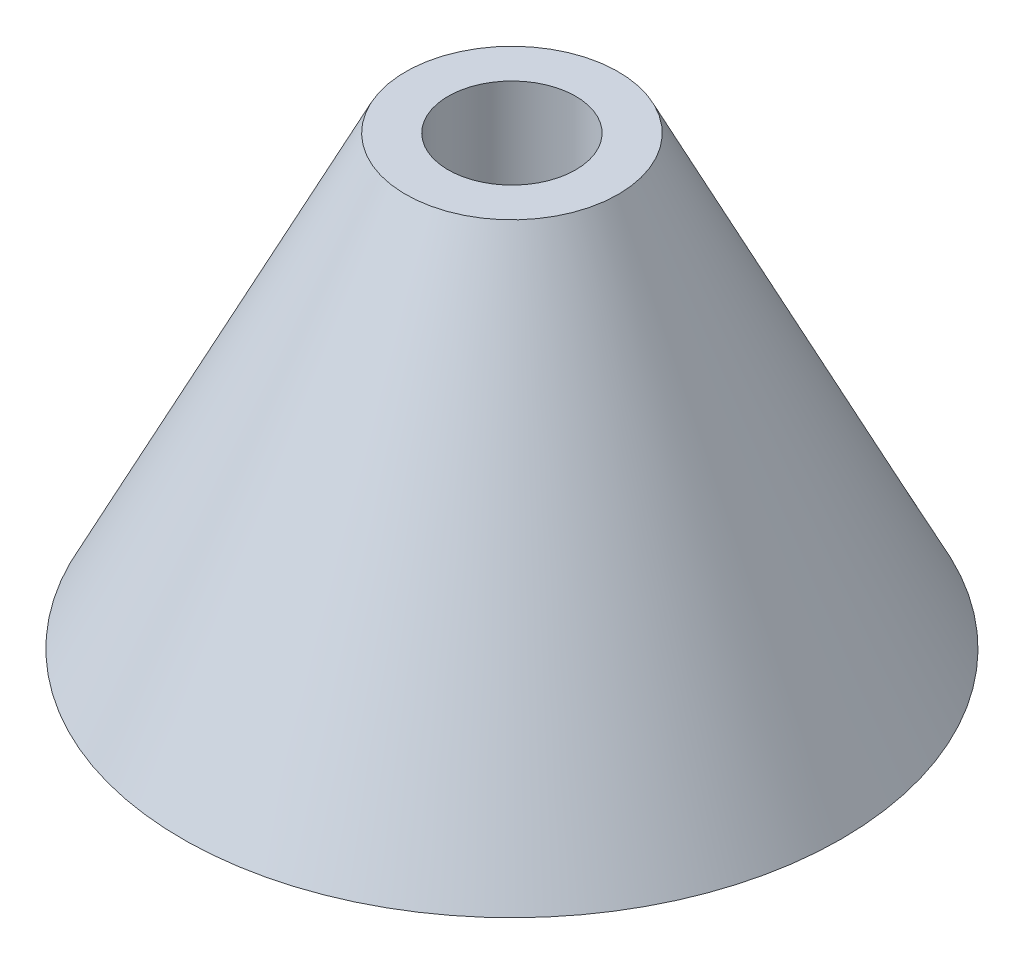
ISO-10303-21;
HEADER;
FILE_DESCRIPTION(('STEP AP214'),'2;1');
FILE_NAME('part.step','',(''),(''),'','','');
FILE_SCHEMA(('AUTOMOTIVE_DESIGN { 1 0 10303 214 1 1 1 1 }'));
ENDSEC;
DATA;
#1=APPLICATION_CONTEXT('core data for automotive mechanical design processes');
#2=APPLICATION_PROTOCOL_DEFINITION('international standard','automotive_design',2000,#1);
#3=PRODUCT_CONTEXT('',#1,'mechanical');
#4=PRODUCT('Part','Part','',(#3));
#5=PRODUCT_RELATED_PRODUCT_CATEGORY('part','',(#4));
#6=PRODUCT_DEFINITION_FORMATION('','',#4);
#7=PRODUCT_DEFINITION_CONTEXT('part definition',#1,'design');
#8=PRODUCT_DEFINITION('design','',#6,#7);
#9=PRODUCT_DEFINITION_SHAPE('','',#8);
#10=(LENGTH_UNIT() NAMED_UNIT(*) SI_UNIT(.MILLI.,.METRE.));
#11=(NAMED_UNIT(*) PLANE_ANGLE_UNIT() SI_UNIT($,.RADIAN.));
#12=(NAMED_UNIT(*) SI_UNIT($,.STERADIAN.) SOLID_ANGLE_UNIT());
#13=UNCERTAINTY_MEASURE_WITH_UNIT(LENGTH_MEASURE(1.E-05),#10,'distance_accuracy_value','');
#14=(GEOMETRIC_REPRESENTATION_CONTEXT(3) GLOBAL_UNCERTAINTY_ASSIGNED_CONTEXT((#13)) GLOBAL_UNIT_ASSIGNED_CONTEXT((#10,
#11,#12)) REPRESENTATION_CONTEXT('',''));
#15=CARTESIAN_POINT('',(0.,0.,0.));
#16=DIRECTION('',(0.,0.,1.));
#17=DIRECTION('',(1.,0.,0.));
#18=AXIS2_PLACEMENT_3D('',#15,#16,#17);
#19=CARTESIAN_POINT('',(31.,-5.22222222222258,0.));
#20=DIRECTION('',(0.,-1.,0.));
#21=DIRECTION('',(1.,0.,0.));
#22=AXIS2_PLACEMENT_3D('',#19,#20,#21);
#23=PLANE('',#22);
#24=CARTESIAN_POINT('',(0.,-5.22222222222273,0.));
#25=DIRECTION('',(0.,-1.,0.));
#26=DIRECTION('',(1.,0.,0.));
#27=AXIS2_PLACEMENT_3D('',#24,#25,#26);
#28=CIRCLE('',#27,31.);
#29=CARTESIAN_POINT('',(31.,-5.22222222222263,0.));
#30=VERTEX_POINT('',#29);
#31=EDGE_CURVE('E49',#30,#30,#28,.T.);
#32=ORIENTED_EDGE('',*,*,#31,.T.);
#33=EDGE_LOOP('',(#32));
#34=FACE_BOUND('',#33,.T.);
#35=CARTESIAN_POINT('',(0.,-5.22222222222265,0.));
#36=DIRECTION('',(0.,-1.,0.));
#37=DIRECTION('',(1.,0.,0.));
#38=AXIS2_PLACEMENT_3D('',#35,#36,#37);
#39=CIRCLE('',#38,5.99999999999998);
#40=CARTESIAN_POINT('',(6.,-5.22222222222263,0.));
#41=VERTEX_POINT('',#40);
#42=EDGE_CURVE('E10',#41,#41,#39,.T.);
#43=ORIENTED_EDGE('',*,*,#42,.F.);
#44=EDGE_LOOP('',(#43));
#45=FACE_BOUND('',#44,.T.);
#46=ADVANCED_FACE('F35',(#34,#45),#23,.T.);
#47=CARTESIAN_POINT('',(0.,0.,0.));
#48=DIRECTION('',(0.,-1.,0.));
#49=DIRECTION('',(1.,0.,0.));
#50=AXIS2_PLACEMENT_3D('',#47,#48,#49);
#51=CYLINDRICAL_SURFACE('',#50,6.00000000000002);
#52=ORIENTED_EDGE('',*,*,#42,.T.);
#53=EDGE_LOOP('',(#52));
#54=FACE_BOUND('',#53,.T.);
#55=CARTESIAN_POINT('',(-1.26173597950183E-13,36.7777777777774,0.));
#56=DIRECTION('',(0.,-1.,0.));
#57=DIRECTION('',(1.,0.,0.));
#58=AXIS2_PLACEMENT_3D('',#55,#56,#57);
#59=CIRCLE('',#58,6.00000000000006);
#60=CARTESIAN_POINT('',(5.99999999999994,36.7777777777774,0.));
#61=VERTEX_POINT('',#60);
#62=EDGE_CURVE('E41',#61,#61,#59,.T.);
#63=ORIENTED_EDGE('',*,*,#62,.F.);
#64=EDGE_LOOP('',(#63));
#65=FACE_BOUND('',#64,.T.);
#66=ADVANCED_FACE('F65',(#54,#65),#51,.F.);
#67=CARTESIAN_POINT('',(5.99999999999994,36.7777777777774,0.));
#68=DIRECTION('',(0.,1.,0.));
#69=DIRECTION('',(-1.,0.,0.));
#70=AXIS2_PLACEMENT_3D('',#67,#68,#69);
#71=PLANE('',#70);
#72=ORIENTED_EDGE('',*,*,#62,.T.);
#73=EDGE_LOOP('',(#72));
#74=FACE_BOUND('',#73,.T.);
#75=CARTESIAN_POINT('',(-1.26173597950183E-13,36.7777777777773,0.));
#76=DIRECTION('',(0.,-1.,0.));
#77=DIRECTION('',(1.,0.,0.));
#78=AXIS2_PLACEMENT_3D('',#75,#76,#77);
#79=CIRCLE('',#78,10.0000000000001);
#80=CARTESIAN_POINT('',(10.,36.7777777777774,0.));
#81=VERTEX_POINT('',#80);
#82=EDGE_CURVE('E45',#81,#81,#79,.T.);
#83=ORIENTED_EDGE('',*,*,#82,.F.);
#84=EDGE_LOOP('',(#83));
#85=FACE_BOUND('',#84,.T.);
#86=ADVANCED_FACE('F59',(#74,#85),#71,.T.);
#87=CARTESIAN_POINT('',(0.,-5.22222222222273,0.));
#88=DIRECTION('',(0.,-1.,0.));
#89=DIRECTION('',(1.,0.,0.));
#90=AXIS2_PLACEMENT_3D('',#87,#88,#89);
#91=CONICAL_SURFACE('',#90,31.,0.463647609000803);
#92=CARTESIAN_POINT('',(10.,36.7777777777774,0.));
#93=CARTESIAN_POINT('',(10.21875,36.3402777777774,0.));
#94=CARTESIAN_POINT('',(10.4375,35.9027777777774,0.));
#95=CARTESIAN_POINT('',(10.875,35.0277777777774,0.));
#96=CARTESIAN_POINT('',(11.09375,34.5902777777774,0.));
#97=CARTESIAN_POINT('',(11.53125,33.7152777777774,0.));
#98=CARTESIAN_POINT('',(11.75,33.2777777777774,0.));
#99=CARTESIAN_POINT('',(12.1875,32.4027777777774,0.));
#100=CARTESIAN_POINT('',(12.40625,31.9652777777774,0.));
#101=CARTESIAN_POINT('',(12.84375,31.0902777777774,0.));
#102=CARTESIAN_POINT('',(13.0625,30.6527777777774,0.));
#103=CARTESIAN_POINT('',(13.5,29.7777777777774,0.));
#104=CARTESIAN_POINT('',(13.71875,29.3402777777774,0.));
#105=CARTESIAN_POINT('',(14.15625,28.4652777777774,0.));
#106=CARTESIAN_POINT('',(14.375,28.0277777777774,0.));
#107=CARTESIAN_POINT('',(14.8125,27.1527777777774,0.));
#108=CARTESIAN_POINT('',(15.03125,26.7152777777774,0.));
#109=CARTESIAN_POINT('',(15.46875,25.8402777777774,0.));
#110=CARTESIAN_POINT('',(15.6875,25.4027777777774,0.));
#111=CARTESIAN_POINT('',(16.125,24.5277777777774,0.));
#112=CARTESIAN_POINT('',(16.34375,24.0902777777774,0.));
#113=CARTESIAN_POINT('',(16.78125,23.2152777777774,0.));
#114=CARTESIAN_POINT('',(17.,22.7777777777774,0.));
#115=CARTESIAN_POINT('',(17.4375,21.9027777777774,0.));
#116=CARTESIAN_POINT('',(17.65625,21.4652777777774,0.));
#117=CARTESIAN_POINT('',(18.09375,20.5902777777774,0.));
#118=CARTESIAN_POINT('',(18.3125,20.1527777777774,0.));
#119=CARTESIAN_POINT('',(18.75,19.2777777777774,0.));
#120=CARTESIAN_POINT('',(18.96875,18.8402777777774,0.));
#121=CARTESIAN_POINT('',(19.40625,17.9652777777774,0.));
#122=CARTESIAN_POINT('',(19.625,17.5277777777774,0.));
#123=CARTESIAN_POINT('',(20.0625,16.6527777777774,0.));
#124=CARTESIAN_POINT('',(20.28125,16.2152777777774,0.));
#125=CARTESIAN_POINT('',(20.71875,15.3402777777774,0.));
#126=CARTESIAN_POINT('',(20.9375,14.9027777777774,0.));
#127=CARTESIAN_POINT('',(21.375,14.0277777777774,0.));
#128=CARTESIAN_POINT('',(21.59375,13.5902777777774,0.));
#129=CARTESIAN_POINT('',(22.03125,12.7152777777774,0.));
#130=CARTESIAN_POINT('',(22.25,12.2777777777774,0.));
#131=CARTESIAN_POINT('',(22.6875,11.4027777777774,0.));
#132=CARTESIAN_POINT('',(22.90625,10.9652777777774,0.));
#133=CARTESIAN_POINT('',(23.34375,10.0902777777774,0.));
#134=CARTESIAN_POINT('',(23.5625,9.65277777777737,0.));
#135=CARTESIAN_POINT('',(24.,8.77777777777737,0.));
#136=CARTESIAN_POINT('',(24.21875,8.34027777777737,0.));
#137=CARTESIAN_POINT('',(24.65625,7.46527777777737,0.));
#138=CARTESIAN_POINT('',(24.875,7.02777777777737,0.));
#139=CARTESIAN_POINT('',(25.3125,6.15277777777737,0.));
#140=CARTESIAN_POINT('',(25.53125,5.71527777777737,0.));
#141=CARTESIAN_POINT('',(25.96875,4.84027777777737,0.));
#142=CARTESIAN_POINT('',(26.1875,4.40277777777737,0.));
#143=CARTESIAN_POINT('',(26.625,3.52777777777737,0.));
#144=CARTESIAN_POINT('',(26.84375,3.09027777777738,0.));
#145=CARTESIAN_POINT('',(27.28125,2.21527777777738,0.));
#146=CARTESIAN_POINT('',(27.5,1.77777777777738,0.));
#147=CARTESIAN_POINT('',(27.9375,0.902777777777375,0.));
#148=CARTESIAN_POINT('',(28.15625,0.465277777777373,0.));
#149=CARTESIAN_POINT('',(28.59375,-0.409722222222629,0.));
#150=CARTESIAN_POINT('',(28.8125,-0.847222222222628,0.));
#151=CARTESIAN_POINT('',(29.25,-1.72222222222263,0.));
#152=CARTESIAN_POINT('',(29.46875,-2.15972222222263,0.));
#153=CARTESIAN_POINT('',(29.90625,-3.03472222222263,0.));
#154=CARTESIAN_POINT('',(30.125,-3.47222222222263,0.));
#155=CARTESIAN_POINT('',(30.5625,-4.34722222222262,0.));
#156=CARTESIAN_POINT('',(30.78125,-4.78472222222262,0.));
#157=CARTESIAN_POINT('',(31.,-5.22222222222262,0.));
#158=B_SPLINE_CURVE_WITH_KNOTS('',3,(#92,#93,#94,#95,#96,#97,#98,#99,#100,#101,#102,#103,#104,
#105,#106,#107,#108,#109,#110,#111,#112,#113,#114,#115,#116,#117,#118,#119,#120,#121,#122,#123,
#124,#125,#126,#127,#128,#129,#130,#131,#132,#133,#134,#135,#136,#137,#138,#139,#140,#141,#142,
#143,#144,#145,#146,#147,#148,#149,#150,#151,#152,#153,#154,#155,#156,#157),.UNSPECIFIED.,.F.,
.F.,(4,2,2,2,2,2,2,2,2,2,2,2,2,2,2,2,2,2,2,2,2,2,2,2,2,2,2,2,2,2,2,2,4),(0.,1.46741961023424,
2.93483922046847,4.40225883070271,5.86967844093694,7.33709805117118,8.80451766140542,
10.2719372716397,11.7393568818739,13.2067764921081,14.6741961023424,16.1416157125766,
17.6090353228108,19.0764549330451,20.5438745432793,22.0112941535135,23.4787137637478,
24.946133373982,26.4135529842163,27.8809725944505,29.3483922046847,30.815811814919,
32.2832314251532,33.7506510353874,35.2180706456217,36.6854902558559,38.1529098660901,
39.6203294763244,41.0877490865586,42.5551686967929,44.0225883070271,45.4900079172613,
46.9574275274956),.UNSPECIFIED.);
#159=EDGE_CURVE('BSEAM57',#81,#30,#158,.T.);
#160=ORIENTED_EDGE('',*,*,#82,.T.);
#161=ORIENTED_EDGE('',*,*,#31,.F.);
#162=ORIENTED_EDGE('',*,*,#159,.T.);
#163=ORIENTED_EDGE('',*,*,#159,.F.);
#164=EDGE_LOOP('',(#160,#162,#161,#163));
#165=FACE_BOUND('',#164,.T.);
#166=ADVANCED_FACE('F57',(#165),#91,.T.);
#167=CLOSED_SHELL('',(#46,#66,#86,#166));
#168=MANIFOLD_SOLID_BREP('B2',#167);
#169=ADVANCED_BREP_SHAPE_REPRESENTATION('',(#18,#168),#14);
#170=SHAPE_DEFINITION_REPRESENTATION(#9,#169);
ENDSEC;
END-ISO-10303-21;
